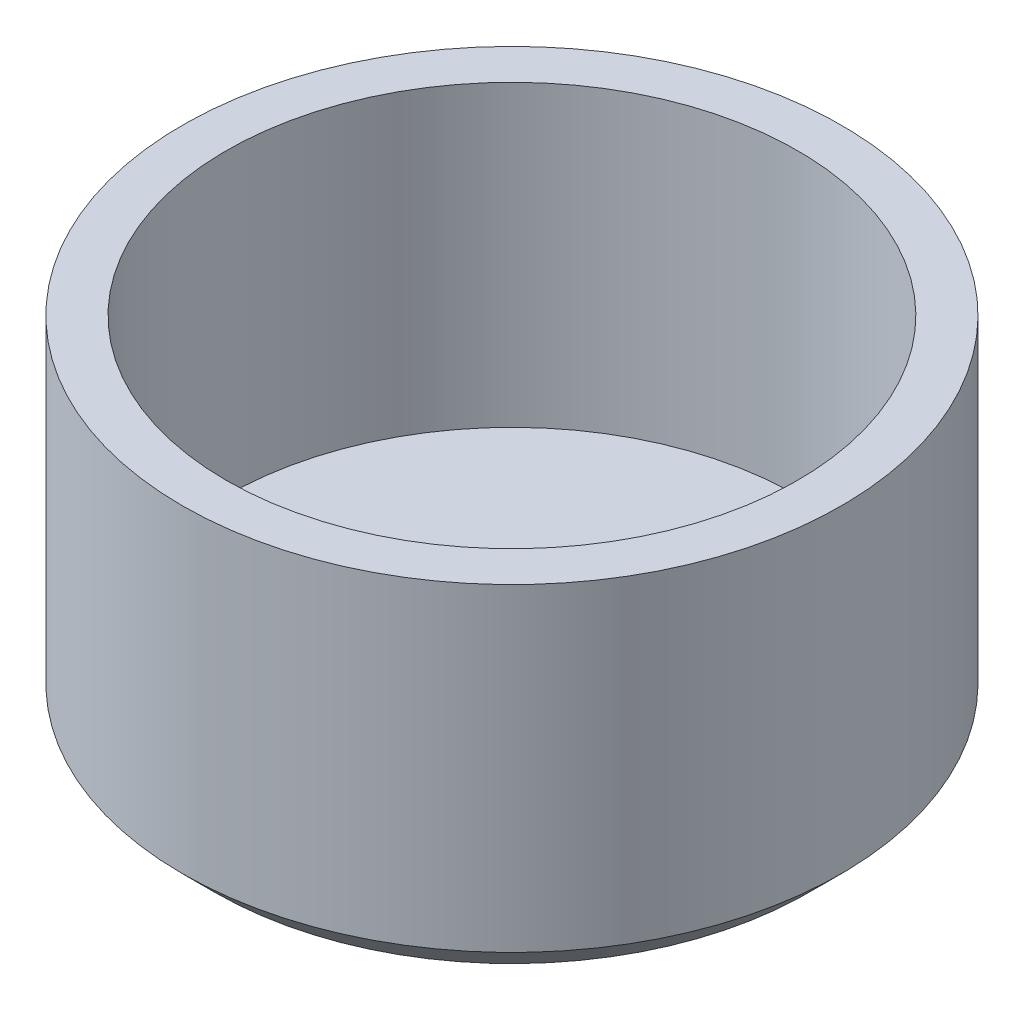
ISO-10303-21;
HEADER;
FILE_DESCRIPTION(('STEP AP214'),'2;1');
FILE_NAME('part.step','',(''),(''),'','','');
FILE_SCHEMA(('AUTOMOTIVE_DESIGN { 1 0 10303 214 1 1 1 1 }'));
ENDSEC;
DATA;
#1=APPLICATION_CONTEXT('core data for automotive mechanical design processes');
#2=APPLICATION_PROTOCOL_DEFINITION('international standard','automotive_design',2000,#1);
#3=PRODUCT_CONTEXT('',#1,'mechanical');
#4=PRODUCT('Part','Part','',(#3));
#5=PRODUCT_RELATED_PRODUCT_CATEGORY('part','',(#4));
#6=PRODUCT_DEFINITION_FORMATION('','',#4);
#7=PRODUCT_DEFINITION_CONTEXT('part definition',#1,'design');
#8=PRODUCT_DEFINITION('design','',#6,#7);
#9=PRODUCT_DEFINITION_SHAPE('','',#8);
#10=(LENGTH_UNIT() NAMED_UNIT(*) SI_UNIT(.MILLI.,.METRE.));
#11=(NAMED_UNIT(*) PLANE_ANGLE_UNIT() SI_UNIT($,.RADIAN.));
#12=(NAMED_UNIT(*) SI_UNIT($,.STERADIAN.) SOLID_ANGLE_UNIT());
#13=UNCERTAINTY_MEASURE_WITH_UNIT(LENGTH_MEASURE(1.E-05),#10,'distance_accuracy_value','');
#14=(GEOMETRIC_REPRESENTATION_CONTEXT(3) GLOBAL_UNCERTAINTY_ASSIGNED_CONTEXT((#13)) GLOBAL_UNIT_ASSIGNED_CONTEXT((#10,
#11,#12)) REPRESENTATION_CONTEXT('',''));
#15=CARTESIAN_POINT('',(0.,0.,0.));
#16=DIRECTION('',(0.,0.,1.));
#17=DIRECTION('',(1.,0.,0.));
#18=AXIS2_PLACEMENT_3D('',#15,#16,#17);
#19=CARTESIAN_POINT('',(0.,16.,0.));
#20=DIRECTION('',(0.,-1.,0.));
#21=DIRECTION('',(0.,0.,-1.));
#22=AXIS2_PLACEMENT_3D('',#19,#20,#21);
#23=CYLINDRICAL_SURFACE('',#22,1.5);
#24=DIRECTION('',(0.,-1.,0.));
#25=VECTOR('',#24,1.);
#26=CARTESIAN_POINT('',(-1.26885775404495,16.,-0.8));
#27=LINE('',#26,#25);
#28=CARTESIAN_POINT('',(-1.26885775404495,2.4,-0.8));
#29=VERTEX_POINT('',#28);
#30=CARTESIAN_POINT('',(-1.26885775404495,0.,-0.8));
#31=VERTEX_POINT('',#30);
#32=EDGE_CURVE('E69',#29,#31,#27,.T.);
#33=ORIENTED_EDGE('',*,*,#32,.F.);
#34=CARTESIAN_POINT('',(0.,2.4,0.));
#35=DIRECTION('',(0.,1.,0.));
#36=DIRECTION('',(0.,0.,1.));
#37=AXIS2_PLACEMENT_3D('',#34,#35,#36);
#38=CIRCLE('',#37,1.5);
#39=CARTESIAN_POINT('',(1.26885775404495,2.4,-0.8));
#40=VERTEX_POINT('',#39);
#41=EDGE_CURVE('E51',#29,#40,#38,.T.);
#42=ORIENTED_EDGE('',*,*,#41,.T.);
#43=DIRECTION('',(0.,-1.,0.));
#44=VECTOR('',#43,1.);
#45=CARTESIAN_POINT('',(1.26885775404495,16.,-0.8));
#46=LINE('',#45,#44);
#47=CARTESIAN_POINT('',(1.26885775404495,0.,-0.8));
#48=VERTEX_POINT('',#47);
#49=EDGE_CURVE('E58',#40,#48,#46,.T.);
#50=ORIENTED_EDGE('',*,*,#49,.T.);
#51=CARTESIAN_POINT('',(0.,0.,0.));
#52=DIRECTION('',(0.,1.,0.));
#53=DIRECTION('',(0.,0.,1.));
#54=AXIS2_PLACEMENT_3D('',#51,#52,#53);
#55=CIRCLE('',#54,1.5);
#56=EDGE_CURVE('E71',#31,#48,#55,.T.);
#57=ORIENTED_EDGE('',*,*,#56,.F.);
#58=EDGE_LOOP('',(#33,#42,#50,#57));
#59=FACE_BOUND('',#58,.T.);
#60=ADVANCED_FACE('F37',(#59),#23,.F.);
#61=CARTESIAN_POINT('',(0.,16.,-0.8));
#62=DIRECTION('',(0.,0.,-1.));
#63=DIRECTION('',(-1.,0.,0.));
#64=AXIS2_PLACEMENT_3D('',#61,#62,#63);
#65=PLANE('',#64);
#66=DIRECTION('',(1.,0.,0.));
#67=VECTOR('',#66,1.);
#68=CARTESIAN_POINT('',(0.,2.4,-0.8));
#69=LINE('',#68,#67);
#70=EDGE_CURVE('E64',#29,#40,#69,.T.);
#71=ORIENTED_EDGE('',*,*,#70,.F.);
#72=ORIENTED_EDGE('',*,*,#32,.T.);
#73=DIRECTION('',(1.,0.,0.));
#74=VECTOR('',#73,1.);
#75=CARTESIAN_POINT('',(0.,0.,-0.8));
#76=LINE('',#75,#74);
#77=EDGE_CURVE('E76',#31,#48,#76,.T.);
#78=ORIENTED_EDGE('',*,*,#77,.T.);
#79=ORIENTED_EDGE('',*,*,#49,.F.);
#80=EDGE_LOOP('',(#71,#72,#78,#79));
#81=FACE_BOUND('',#80,.T.);
#82=ADVANCED_FACE('F74',(#81),#65,.F.);
#83=CARTESIAN_POINT('',(0.,16.,0.));
#84=DIRECTION('',(0.,-1.,0.));
#85=DIRECTION('',(0.,0.,-1.));
#86=AXIS2_PLACEMENT_3D('',#83,#84,#85);
#87=CYLINDRICAL_SURFACE('',#86,15.);
#88=CARTESIAN_POINT('',(0.,1.5,0.));
#89=DIRECTION('',(0.,1.,0.));
#90=DIRECTION('',(0.,0.,1.));
#91=AXIS2_PLACEMENT_3D('',#88,#89,#90);
#92=CIRCLE('',#91,15.);
#93=CARTESIAN_POINT('',(0.,1.5,15.));
#94=VERTEX_POINT('',#93);
#95=EDGE_CURVE('E45',#94,#94,#92,.T.);
#96=ORIENTED_EDGE('',*,*,#95,.T.);
#97=EDGE_LOOP('',(#96));
#98=FACE_BOUND('',#97,.T.);
#99=CARTESIAN_POINT('',(0.,16.,0.));
#100=DIRECTION('',(0.,1.,0.));
#101=DIRECTION('',(0.,0.,1.));
#102=AXIS2_PLACEMENT_3D('',#99,#100,#101);
#103=CIRCLE('',#102,15.);
#104=CARTESIAN_POINT('',(0.,16.,15.));
#105=VERTEX_POINT('',#104);
#106=EDGE_CURVE('E78',#105,#105,#103,.T.);
#107=ORIENTED_EDGE('',*,*,#106,.F.);
#108=EDGE_LOOP('',(#107));
#109=FACE_BOUND('',#108,.T.);
#110=ADVANCED_FACE('F88',(#98,#109),#87,.T.);
#111=CARTESIAN_POINT('',(0.,16.,0.));
#112=DIRECTION('',(0.,1.,0.));
#113=DIRECTION('',(0.,0.,1.));
#114=AXIS2_PLACEMENT_3D('',#111,#112,#113);
#115=PLANE('',#114);
#116=CARTESIAN_POINT('',(0.,16.,0.));
#117=DIRECTION('',(0.,1.,0.));
#118=DIRECTION('',(0.,0.,1.));
#119=AXIS2_PLACEMENT_3D('',#116,#117,#118);
#120=CIRCLE('',#119,13.);
#121=CARTESIAN_POINT('',(0.,16.,13.));
#122=VERTEX_POINT('',#121);
#123=EDGE_CURVE('E129',#122,#122,#120,.T.);
#124=ORIENTED_EDGE('',*,*,#123,.F.);
#125=EDGE_LOOP('',(#124));
#126=FACE_BOUND('',#125,.T.);
#127=ORIENTED_EDGE('',*,*,#106,.T.);
#128=EDGE_LOOP('',(#127));
#129=FACE_BOUND('',#128,.T.);
#130=ADVANCED_FACE('F107',(#126,#129),#115,.T.);
#131=CARTESIAN_POINT('',(0.,0.,0.));
#132=DIRECTION('',(0.,1.,0.));
#133=DIRECTION('',(0.,0.,1.));
#134=AXIS2_PLACEMENT_3D('',#131,#132,#133);
#135=PLANE('',#134);
#136=CARTESIAN_POINT('',(0.,0.,0.));
#137=DIRECTION('',(0.,1.,0.));
#138=DIRECTION('',(0.,0.,1.));
#139=AXIS2_PLACEMENT_3D('',#136,#137,#138);
#140=CIRCLE('',#139,13.5);
#141=CARTESIAN_POINT('',(0.,0.,13.5));
#142=VERTEX_POINT('',#141);
#143=EDGE_CURVE('E11',#142,#142,#140,.F.);
#144=ORIENTED_EDGE('',*,*,#143,.T.);
#145=EDGE_LOOP('',(#144));
#146=FACE_BOUND('',#145,.T.);
#147=ORIENTED_EDGE('',*,*,#56,.T.);
#148=ORIENTED_EDGE('',*,*,#77,.F.);
#149=EDGE_LOOP('',(#147,#148));
#150=FACE_BOUND('',#149,.T.);
#151=ADVANCED_FACE('F111',(#146,#150),#135,.F.);
#152=CARTESIAN_POINT('',(0.,2.4,0.));
#153=DIRECTION('',(0.,1.,0.));
#154=DIRECTION('',(0.,0.,1.));
#155=AXIS2_PLACEMENT_3D('',#152,#153,#154);
#156=CYLINDRICAL_SURFACE('',#155,13.);
#157=CARTESIAN_POINT('',(0.,2.4,0.));
#158=DIRECTION('',(0.,1.,0.));
#159=DIRECTION('',(0.,0.,1.));
#160=AXIS2_PLACEMENT_3D('',#157,#158,#159);
#161=CIRCLE('',#160,13.);
#162=CARTESIAN_POINT('',(0.,2.4,13.));
#163=VERTEX_POINT('',#162);
#164=EDGE_CURVE('E72',#163,#163,#161,.T.);
#165=ORIENTED_EDGE('',*,*,#164,.F.);
#166=EDGE_LOOP('',(#165));
#167=FACE_BOUND('',#166,.T.);
#168=ORIENTED_EDGE('',*,*,#123,.T.);
#169=EDGE_LOOP('',(#168));
#170=FACE_BOUND('',#169,.T.);
#171=ADVANCED_FACE('F96',(#167,#170),#156,.F.);
#172=CARTESIAN_POINT('',(0.,2.4,0.));
#173=DIRECTION('',(0.,1.,0.));
#174=DIRECTION('',(0.,0.,1.));
#175=AXIS2_PLACEMENT_3D('',#172,#173,#174);
#176=PLANE('',#175);
#177=ORIENTED_EDGE('',*,*,#70,.T.);
#178=ORIENTED_EDGE('',*,*,#41,.F.);
#179=EDGE_LOOP('',(#177,#178));
#180=FACE_BOUND('',#179,.T.);
#181=ORIENTED_EDGE('',*,*,#164,.T.);
#182=EDGE_LOOP('',(#181));
#183=FACE_BOUND('',#182,.T.);
#184=ADVANCED_FACE('F65',(#180,#183),#176,.T.);
#185=CARTESIAN_POINT('',(0.,1.5,0.));
#186=DIRECTION('',(0.,1.,0.));
#187=DIRECTION('',(0.,0.,1.));
#188=AXIS2_PLACEMENT_3D('',#185,#186,#187);
#189=CONICAL_SURFACE('',#188,15.,0.78539816339745);
#190=ORIENTED_EDGE('',*,*,#143,.F.);
#191=EDGE_LOOP('',(#190));
#192=FACE_BOUND('',#191,.T.);
#193=ORIENTED_EDGE('',*,*,#95,.F.);
#194=EDGE_LOOP('',(#193));
#195=FACE_BOUND('',#194,.T.);
#196=ADVANCED_FACE('F39',(#192,#195),#189,.T.);
#197=CLOSED_SHELL('',(#60,#82,#110,#130,#151,#171,#184,#196));
#198=MANIFOLD_SOLID_BREP('B2',#197);
#199=ADVANCED_BREP_SHAPE_REPRESENTATION('',(#18,#198),#14);
#200=SHAPE_DEFINITION_REPRESENTATION(#9,#199);
ENDSEC;
END-ISO-10303-21;
